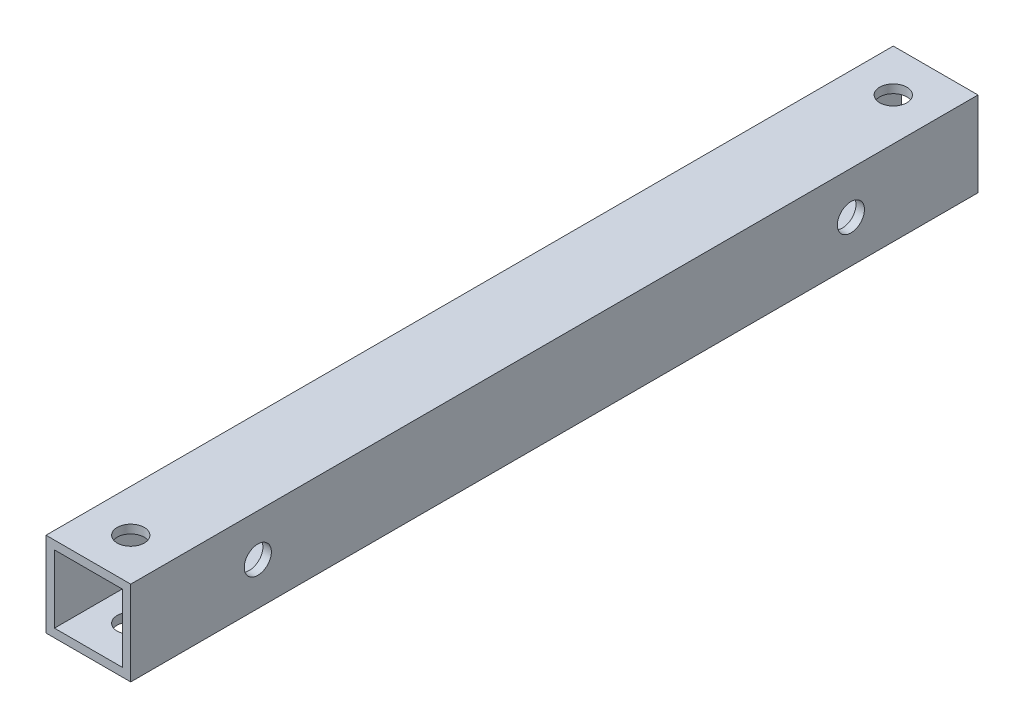
ISO-10303-21;
HEADER;
FILE_DESCRIPTION(('STEP AP214'),'2;1');
FILE_NAME('part.step','',(''),(''),'','','');
FILE_SCHEMA(('AUTOMOTIVE_DESIGN { 1 0 10303 214 1 1 1 1 }'));
ENDSEC;
DATA;
#1=APPLICATION_CONTEXT('core data for automotive mechanical design processes');
#2=APPLICATION_PROTOCOL_DEFINITION('international standard','automotive_design',2000,#1);
#3=PRODUCT_CONTEXT('',#1,'mechanical');
#4=PRODUCT('Part','Part','',(#3));
#5=PRODUCT_RELATED_PRODUCT_CATEGORY('part','',(#4));
#6=PRODUCT_DEFINITION_FORMATION('','',#4);
#7=PRODUCT_DEFINITION_CONTEXT('part definition',#1,'design');
#8=PRODUCT_DEFINITION('design','',#6,#7);
#9=PRODUCT_DEFINITION_SHAPE('','',#8);
#10=(LENGTH_UNIT() NAMED_UNIT(*) SI_UNIT(.MILLI.,.METRE.));
#11=(NAMED_UNIT(*) PLANE_ANGLE_UNIT() SI_UNIT($,.RADIAN.));
#12=(NAMED_UNIT(*) SI_UNIT($,.STERADIAN.) SOLID_ANGLE_UNIT());
#13=UNCERTAINTY_MEASURE_WITH_UNIT(LENGTH_MEASURE(1.E-05),#10,'distance_accuracy_value','');
#14=(GEOMETRIC_REPRESENTATION_CONTEXT(3) GLOBAL_UNCERTAINTY_ASSIGNED_CONTEXT((#13)) GLOBAL_UNIT_ASSIGNED_CONTEXT((#10,
#11,#12)) REPRESENTATION_CONTEXT('',''));
#15=CARTESIAN_POINT('',(0.,0.,0.));
#16=DIRECTION('',(0.,0.,1.));
#17=DIRECTION('',(1.,0.,0.));
#18=AXIS2_PLACEMENT_3D('',#15,#16,#17);
#19=CARTESIAN_POINT('',(0.,0.,100.));
#20=DIRECTION('',(0.,0.,1.));
#21=DIRECTION('',(1.,0.,0.));
#22=AXIS2_PLACEMENT_3D('',#19,#20,#21);
#23=PLANE('',#22);
#24=DIRECTION('',(0.,1.,0.));
#25=VECTOR('',#24,1.);
#26=CARTESIAN_POINT('',(5.,5.,100.));
#27=LINE('',#26,#25);
#28=CARTESIAN_POINT('',(5.,-5.,100.));
#29=VERTEX_POINT('',#28);
#30=CARTESIAN_POINT('',(5.,5.,100.));
#31=VERTEX_POINT('',#30);
#32=EDGE_CURVE('E139',#29,#31,#27,.T.);
#33=ORIENTED_EDGE('',*,*,#32,.T.);
#34=DIRECTION('',(-1.,0.,0.));
#35=VECTOR('',#34,1.);
#36=CARTESIAN_POINT('',(-5.,5.,100.));
#37=LINE('',#36,#35);
#38=CARTESIAN_POINT('',(-5.,5.,100.));
#39=VERTEX_POINT('',#38);
#40=EDGE_CURVE('E142',#31,#39,#37,.T.);
#41=ORIENTED_EDGE('',*,*,#40,.T.);
#42=DIRECTION('',(0.,-1.,0.));
#43=VECTOR('',#42,1.);
#44=CARTESIAN_POINT('',(-5.,5.,100.));
#45=LINE('',#44,#43);
#46=CARTESIAN_POINT('',(-5.,-5.,100.));
#47=VERTEX_POINT('',#46);
#48=EDGE_CURVE('E145',#39,#47,#45,.T.);
#49=ORIENTED_EDGE('',*,*,#48,.T.);
#50=DIRECTION('',(1.,0.,0.));
#51=VECTOR('',#50,1.);
#52=CARTESIAN_POINT('',(-5.,-5.,100.));
#53=LINE('',#52,#51);
#54=EDGE_CURVE('E147',#47,#29,#53,.T.);
#55=ORIENTED_EDGE('',*,*,#54,.T.);
#56=EDGE_LOOP('',(#33,#41,#49,#55));
#57=FACE_BOUND('',#56,.T.);
#58=DIRECTION('',(0.,-1.,0.));
#59=VECTOR('',#58,1.);
#60=CARTESIAN_POINT('',(-4.,4.,100.));
#61=LINE('',#60,#59);
#62=CARTESIAN_POINT('',(-4.,4.,100.));
#63=VERTEX_POINT('',#62);
#64=CARTESIAN_POINT('',(-4.,-4.,100.));
#65=VERTEX_POINT('',#64);
#66=EDGE_CURVE('E109',#63,#65,#61,.T.);
#67=ORIENTED_EDGE('',*,*,#66,.F.);
#68=DIRECTION('',(-1.,0.,0.));
#69=VECTOR('',#68,1.);
#70=CARTESIAN_POINT('',(-4.,4.,100.));
#71=LINE('',#70,#69);
#72=CARTESIAN_POINT('',(4.,4.,100.));
#73=VERTEX_POINT('',#72);
#74=EDGE_CURVE('E101',#73,#63,#71,.T.);
#75=ORIENTED_EDGE('',*,*,#74,.F.);
#76=DIRECTION('',(0.,1.,0.));
#77=VECTOR('',#76,1.);
#78=CARTESIAN_POINT('',(4.,4.,100.));
#79=LINE('',#78,#77);
#80=CARTESIAN_POINT('',(4.,-4.,100.));
#81=VERTEX_POINT('',#80);
#82=EDGE_CURVE('E123',#81,#73,#79,.T.);
#83=ORIENTED_EDGE('',*,*,#82,.F.);
#84=DIRECTION('',(1.,0.,0.));
#85=VECTOR('',#84,1.);
#86=CARTESIAN_POINT('',(-4.,-4.,100.));
#87=LINE('',#86,#85);
#88=EDGE_CURVE('E121',#65,#81,#87,.T.);
#89=ORIENTED_EDGE('',*,*,#88,.F.);
#90=EDGE_LOOP('',(#67,#75,#83,#89));
#91=FACE_BOUND('',#90,.T.);
#92=ADVANCED_FACE('F34',(#57,#91),#23,.T.);
#93=CARTESIAN_POINT('',(0.,0.,0.));
#94=DIRECTION('',(0.,0.,1.));
#95=DIRECTION('',(1.,0.,0.));
#96=AXIS2_PLACEMENT_3D('',#93,#94,#95);
#97=PLANE('',#96);
#98=DIRECTION('',(0.,1.,0.));
#99=VECTOR('',#98,1.);
#100=CARTESIAN_POINT('',(5.,5.,0.));
#101=LINE('',#100,#99);
#102=CARTESIAN_POINT('',(5.,-5.,0.));
#103=VERTEX_POINT('',#102);
#104=CARTESIAN_POINT('',(5.,5.,0.));
#105=VERTEX_POINT('',#104);
#106=EDGE_CURVE('E117',#103,#105,#101,.T.);
#107=ORIENTED_EDGE('',*,*,#106,.F.);
#108=DIRECTION('',(1.,0.,0.));
#109=VECTOR('',#108,1.);
#110=CARTESIAN_POINT('',(-5.,-5.,0.));
#111=LINE('',#110,#109);
#112=CARTESIAN_POINT('',(-5.,-5.,0.));
#113=VERTEX_POINT('',#112);
#114=EDGE_CURVE('E143',#113,#103,#111,.T.);
#115=ORIENTED_EDGE('',*,*,#114,.F.);
#116=DIRECTION('',(0.,-1.,0.));
#117=VECTOR('',#116,1.);
#118=CARTESIAN_POINT('',(-5.,5.,0.));
#119=LINE('',#118,#117);
#120=CARTESIAN_POINT('',(-5.,5.,0.));
#121=VERTEX_POINT('',#120);
#122=EDGE_CURVE('E154',#121,#113,#119,.T.);
#123=ORIENTED_EDGE('',*,*,#122,.F.);
#124=DIRECTION('',(-1.,0.,0.));
#125=VECTOR('',#124,1.);
#126=CARTESIAN_POINT('',(-5.,5.,0.));
#127=LINE('',#126,#125);
#128=EDGE_CURVE('E152',#105,#121,#127,.T.);
#129=ORIENTED_EDGE('',*,*,#128,.F.);
#130=EDGE_LOOP('',(#107,#115,#123,#129));
#131=FACE_BOUND('',#130,.T.);
#132=DIRECTION('',(-1.,0.,0.));
#133=VECTOR('',#132,1.);
#134=CARTESIAN_POINT('',(-4.,4.,0.));
#135=LINE('',#134,#133);
#136=CARTESIAN_POINT('',(4.,4.,0.));
#137=VERTEX_POINT('',#136);
#138=CARTESIAN_POINT('',(-4.,4.,0.));
#139=VERTEX_POINT('',#138);
#140=EDGE_CURVE('E59',#137,#139,#135,.T.);
#141=ORIENTED_EDGE('',*,*,#140,.T.);
#142=DIRECTION('',(0.,-1.,0.));
#143=VECTOR('',#142,1.);
#144=CARTESIAN_POINT('',(-4.,4.,0.));
#145=LINE('',#144,#143);
#146=CARTESIAN_POINT('',(-4.,-4.,0.));
#147=VERTEX_POINT('',#146);
#148=EDGE_CURVE('E116',#139,#147,#145,.T.);
#149=ORIENTED_EDGE('',*,*,#148,.T.);
#150=DIRECTION('',(1.,0.,0.));
#151=VECTOR('',#150,1.);
#152=CARTESIAN_POINT('',(-4.,-4.,0.));
#153=LINE('',#152,#151);
#154=CARTESIAN_POINT('',(4.,-4.,0.));
#155=VERTEX_POINT('',#154);
#156=EDGE_CURVE('E131',#147,#155,#153,.T.);
#157=ORIENTED_EDGE('',*,*,#156,.T.);
#158=DIRECTION('',(0.,1.,0.));
#159=VECTOR('',#158,1.);
#160=CARTESIAN_POINT('',(4.,4.,0.));
#161=LINE('',#160,#159);
#162=EDGE_CURVE('E110',#155,#137,#161,.T.);
#163=ORIENTED_EDGE('',*,*,#162,.T.);
#164=EDGE_LOOP('',(#141,#149,#157,#163));
#165=FACE_BOUND('',#164,.T.);
#166=ADVANCED_FACE('F245',(#131,#165),#97,.F.);
#167=CARTESIAN_POINT('',(5.,5.,100.));
#168=DIRECTION('',(-1.,0.,0.));
#169=DIRECTION('',(0.,-1.,0.));
#170=AXIS2_PLACEMENT_3D('',#167,#168,#169);
#171=PLANE('',#170);
#172=CARTESIAN_POINT('',(5.,0.,85.));
#173=DIRECTION('',(1.,0.,0.));
#174=DIRECTION('',(0.,1.,0.));
#175=AXIS2_PLACEMENT_3D('',#172,#173,#174);
#176=CIRCLE('',#175,1.60000000000001);
#177=CARTESIAN_POINT('',(5.,1.60000000000001,85.));
#178=VERTEX_POINT('',#177);
#179=EDGE_CURVE('E199',#178,#178,#176,.T.);
#180=ORIENTED_EDGE('',*,*,#179,.F.);
#181=EDGE_LOOP('',(#180));
#182=FACE_BOUND('',#181,.T.);
#183=CARTESIAN_POINT('',(5.,0.,15.));
#184=DIRECTION('',(1.,0.,0.));
#185=DIRECTION('',(0.,1.,0.));
#186=AXIS2_PLACEMENT_3D('',#183,#184,#185);
#187=CIRCLE('',#186,1.6);
#188=CARTESIAN_POINT('',(5.,1.6,15.));
#189=VERTEX_POINT('',#188);
#190=EDGE_CURVE('E196',#189,#189,#187,.T.);
#191=ORIENTED_EDGE('',*,*,#190,.F.);
#192=EDGE_LOOP('',(#191));
#193=FACE_BOUND('',#192,.T.);
#194=ORIENTED_EDGE('',*,*,#106,.T.);
#195=DIRECTION('',(0.,0.,-1.));
#196=VECTOR('',#195,1.);
#197=CARTESIAN_POINT('',(5.,5.,100.));
#198=LINE('',#197,#196);
#199=EDGE_CURVE('E11',#31,#105,#198,.T.);
#200=ORIENTED_EDGE('',*,*,#199,.F.);
#201=ORIENTED_EDGE('',*,*,#32,.F.);
#202=DIRECTION('',(0.,0.,-1.));
#203=VECTOR('',#202,1.);
#204=CARTESIAN_POINT('',(5.,-5.,100.));
#205=LINE('',#204,#203);
#206=EDGE_CURVE('E149',#29,#103,#205,.T.);
#207=ORIENTED_EDGE('',*,*,#206,.T.);
#208=EDGE_LOOP('',(#194,#200,#201,#207));
#209=FACE_BOUND('',#208,.T.);
#210=ADVANCED_FACE('F36',(#182,#193,#209),#171,.F.);
#211=CARTESIAN_POINT('',(-5.,5.,100.));
#212=DIRECTION('',(0.,-1.,0.));
#213=DIRECTION('',(0.,0.,-1.));
#214=AXIS2_PLACEMENT_3D('',#211,#212,#213);
#215=PLANE('',#214);
#216=CARTESIAN_POINT('',(0.,5.,95.));
#217=DIRECTION('',(0.,1.,0.));
#218=DIRECTION('',(0.,0.,1.));
#219=AXIS2_PLACEMENT_3D('',#216,#217,#218);
#220=CIRCLE('',#219,1.6);
#221=CARTESIAN_POINT('',(0.,5.,96.6));
#222=VERTEX_POINT('',#221);
#223=EDGE_CURVE('E174',#222,#222,#220,.T.);
#224=ORIENTED_EDGE('',*,*,#223,.F.);
#225=EDGE_LOOP('',(#224));
#226=FACE_BOUND('',#225,.T.);
#227=CARTESIAN_POINT('',(0.,5.,5.));
#228=DIRECTION('',(0.,1.,0.));
#229=DIRECTION('',(0.,0.,1.));
#230=AXIS2_PLACEMENT_3D('',#227,#228,#229);
#231=CIRCLE('',#230,1.6);
#232=CARTESIAN_POINT('',(0.,5.,6.60000000000001));
#233=VERTEX_POINT('',#232);
#234=EDGE_CURVE('E181',#233,#233,#231,.T.);
#235=ORIENTED_EDGE('',*,*,#234,.F.);
#236=EDGE_LOOP('',(#235));
#237=FACE_BOUND('',#236,.T.);
#238=ORIENTED_EDGE('',*,*,#128,.T.);
#239=DIRECTION('',(0.,0.,-1.));
#240=VECTOR('',#239,1.);
#241=CARTESIAN_POINT('',(-5.,5.,100.));
#242=LINE('',#241,#240);
#243=EDGE_CURVE('E43',#39,#121,#242,.T.);
#244=ORIENTED_EDGE('',*,*,#243,.F.);
#245=ORIENTED_EDGE('',*,*,#40,.F.);
#246=ORIENTED_EDGE('',*,*,#199,.T.);
#247=EDGE_LOOP('',(#238,#244,#245,#246));
#248=FACE_BOUND('',#247,.T.);
#249=ADVANCED_FACE('F232',(#226,#237,#248),#215,.F.);
#250=CARTESIAN_POINT('',(-5.,5.,100.));
#251=DIRECTION('',(1.,0.,0.));
#252=DIRECTION('',(0.,1.,0.));
#253=AXIS2_PLACEMENT_3D('',#250,#251,#252);
#254=PLANE('',#253);
#255=CARTESIAN_POINT('',(-5.,0.,85.));
#256=DIRECTION('',(1.,0.,0.));
#257=DIRECTION('',(0.,1.,0.));
#258=AXIS2_PLACEMENT_3D('',#255,#256,#257);
#259=CIRCLE('',#258,1.60000000000001);
#260=CARTESIAN_POINT('',(-5.,1.6,85.));
#261=VERTEX_POINT('',#260);
#262=EDGE_CURVE('E168',#261,#261,#259,.T.);
#263=ORIENTED_EDGE('',*,*,#262,.T.);
#264=EDGE_LOOP('',(#263));
#265=FACE_BOUND('',#264,.T.);
#266=CARTESIAN_POINT('',(-5.,0.,15.));
#267=DIRECTION('',(1.,0.,0.));
#268=DIRECTION('',(0.,1.,0.));
#269=AXIS2_PLACEMENT_3D('',#266,#267,#268);
#270=CIRCLE('',#269,1.6);
#271=CARTESIAN_POINT('',(-5.,1.6,15.));
#272=VERTEX_POINT('',#271);
#273=EDGE_CURVE('E202',#272,#272,#270,.T.);
#274=ORIENTED_EDGE('',*,*,#273,.T.);
#275=EDGE_LOOP('',(#274));
#276=FACE_BOUND('',#275,.T.);
#277=ORIENTED_EDGE('',*,*,#122,.T.);
#278=DIRECTION('',(0.,0.,-1.));
#279=VECTOR('',#278,1.);
#280=CARTESIAN_POINT('',(-5.,-5.,100.));
#281=LINE('',#280,#279);
#282=EDGE_CURVE('E159',#47,#113,#281,.T.);
#283=ORIENTED_EDGE('',*,*,#282,.F.);
#284=ORIENTED_EDGE('',*,*,#48,.F.);
#285=ORIENTED_EDGE('',*,*,#243,.T.);
#286=EDGE_LOOP('',(#277,#283,#284,#285));
#287=FACE_BOUND('',#286,.T.);
#288=ADVANCED_FACE('F228',(#265,#276,#287),#254,.F.);
#289=CARTESIAN_POINT('',(-5.,-5.,100.));
#290=DIRECTION('',(0.,1.,0.));
#291=DIRECTION('',(0.,0.,1.));
#292=AXIS2_PLACEMENT_3D('',#289,#290,#291);
#293=PLANE('',#292);
#294=CARTESIAN_POINT('',(0.,-5.,95.));
#295=DIRECTION('',(0.,1.,0.));
#296=DIRECTION('',(0.,0.,1.));
#297=AXIS2_PLACEMENT_3D('',#294,#295,#296);
#298=CIRCLE('',#297,1.6);
#299=CARTESIAN_POINT('',(0.,-5.,96.6));
#300=VERTEX_POINT('',#299);
#301=EDGE_CURVE('E193',#300,#300,#298,.T.);
#302=ORIENTED_EDGE('',*,*,#301,.T.);
#303=EDGE_LOOP('',(#302));
#304=FACE_BOUND('',#303,.T.);
#305=CARTESIAN_POINT('',(0.,-5.,5.));
#306=DIRECTION('',(0.,1.,0.));
#307=DIRECTION('',(0.,0.,1.));
#308=AXIS2_PLACEMENT_3D('',#305,#306,#307);
#309=CIRCLE('',#308,1.6);
#310=CARTESIAN_POINT('',(0.,-5.,6.60000000000001));
#311=VERTEX_POINT('',#310);
#312=EDGE_CURVE('E178',#311,#311,#309,.T.);
#313=ORIENTED_EDGE('',*,*,#312,.T.);
#314=EDGE_LOOP('',(#313));
#315=FACE_BOUND('',#314,.T.);
#316=ORIENTED_EDGE('',*,*,#114,.T.);
#317=ORIENTED_EDGE('',*,*,#206,.F.);
#318=ORIENTED_EDGE('',*,*,#54,.F.);
#319=ORIENTED_EDGE('',*,*,#282,.T.);
#320=EDGE_LOOP('',(#316,#317,#318,#319));
#321=FACE_BOUND('',#320,.T.);
#322=ADVANCED_FACE('F231',(#304,#315,#321),#293,.F.);
#323=CARTESIAN_POINT('',(-4.,4.,100.));
#324=DIRECTION('',(0.,-1.,0.));
#325=DIRECTION('',(0.,0.,-1.));
#326=AXIS2_PLACEMENT_3D('',#323,#324,#325);
#327=PLANE('',#326);
#328=CARTESIAN_POINT('',(0.,4.,95.));
#329=DIRECTION('',(0.,-1.,0.));
#330=DIRECTION('',(0.,0.,-1.));
#331=AXIS2_PLACEMENT_3D('',#328,#329,#330);
#332=CIRCLE('',#331,1.6);
#333=CARTESIAN_POINT('',(0.,4.,93.4));
#334=VERTEX_POINT('',#333);
#335=EDGE_CURVE('E190',#334,#334,#332,.T.);
#336=ORIENTED_EDGE('',*,*,#335,.F.);
#337=EDGE_LOOP('',(#336));
#338=FACE_BOUND('',#337,.T.);
#339=CARTESIAN_POINT('',(0.,4.,5.));
#340=DIRECTION('',(0.,-1.,0.));
#341=DIRECTION('',(0.,0.,-1.));
#342=AXIS2_PLACEMENT_3D('',#339,#340,#341);
#343=CIRCLE('',#342,1.6);
#344=CARTESIAN_POINT('',(0.,4.,3.4));
#345=VERTEX_POINT('',#344);
#346=EDGE_CURVE('E173',#345,#345,#343,.T.);
#347=ORIENTED_EDGE('',*,*,#346,.F.);
#348=EDGE_LOOP('',(#347));
#349=FACE_BOUND('',#348,.T.);
#350=ORIENTED_EDGE('',*,*,#140,.F.);
#351=DIRECTION('',(0.,0.,-1.));
#352=VECTOR('',#351,1.);
#353=CARTESIAN_POINT('',(4.,4.,100.));
#354=LINE('',#353,#352);
#355=EDGE_CURVE('E105',#73,#137,#354,.T.);
#356=ORIENTED_EDGE('',*,*,#355,.F.);
#357=ORIENTED_EDGE('',*,*,#74,.T.);
#358=DIRECTION('',(0.,0.,-1.));
#359=VECTOR('',#358,1.);
#360=CARTESIAN_POINT('',(-4.,4.,100.));
#361=LINE('',#360,#359);
#362=EDGE_CURVE('E104',#63,#139,#361,.T.);
#363=ORIENTED_EDGE('',*,*,#362,.T.);
#364=EDGE_LOOP('',(#350,#356,#357,#363));
#365=FACE_BOUND('',#364,.T.);
#366=ADVANCED_FACE('F103',(#338,#349,#365),#327,.T.);
#367=CARTESIAN_POINT('',(-4.,4.,100.));
#368=DIRECTION('',(1.,0.,0.));
#369=DIRECTION('',(0.,1.,0.));
#370=AXIS2_PLACEMENT_3D('',#367,#368,#369);
#371=PLANE('',#370);
#372=CARTESIAN_POINT('',(-4.,0.,85.));
#373=DIRECTION('',(1.,0.,0.));
#374=DIRECTION('',(0.,1.,0.));
#375=AXIS2_PLACEMENT_3D('',#372,#373,#374);
#376=CIRCLE('',#375,1.60000000000001);
#377=CARTESIAN_POINT('',(-4.,1.6,85.));
#378=VERTEX_POINT('',#377);
#379=EDGE_CURVE('E129',#378,#378,#376,.T.);
#380=ORIENTED_EDGE('',*,*,#379,.F.);
#381=EDGE_LOOP('',(#380));
#382=FACE_BOUND('',#381,.T.);
#383=CARTESIAN_POINT('',(-4.,0.,15.));
#384=DIRECTION('',(1.,0.,0.));
#385=DIRECTION('',(0.,1.,0.));
#386=AXIS2_PLACEMENT_3D('',#383,#384,#385);
#387=CIRCLE('',#386,1.6);
#388=CARTESIAN_POINT('',(-4.,1.6,15.));
#389=VERTEX_POINT('',#388);
#390=EDGE_CURVE('E167',#389,#389,#387,.T.);
#391=ORIENTED_EDGE('',*,*,#390,.F.);
#392=EDGE_LOOP('',(#391));
#393=FACE_BOUND('',#392,.T.);
#394=ORIENTED_EDGE('',*,*,#148,.F.);
#395=ORIENTED_EDGE('',*,*,#362,.F.);
#396=ORIENTED_EDGE('',*,*,#66,.T.);
#397=DIRECTION('',(0.,0.,-1.));
#398=VECTOR('',#397,1.);
#399=CARTESIAN_POINT('',(-4.,-4.,100.));
#400=LINE('',#399,#398);
#401=EDGE_CURVE('E118',#65,#147,#400,.T.);
#402=ORIENTED_EDGE('',*,*,#401,.T.);
#403=EDGE_LOOP('',(#394,#395,#396,#402));
#404=FACE_BOUND('',#403,.T.);
#405=ADVANCED_FACE('F113',(#382,#393,#404),#371,.T.);
#406=CARTESIAN_POINT('',(-4.,-4.,100.));
#407=DIRECTION('',(0.,1.,0.));
#408=DIRECTION('',(-1.,0.,0.));
#409=AXIS2_PLACEMENT_3D('',#406,#407,#408);
#410=PLANE('',#409);
#411=CARTESIAN_POINT('',(0.,-4.,95.));
#412=DIRECTION('',(0.,1.,0.));
#413=DIRECTION('',(-1.,0.,0.));
#414=AXIS2_PLACEMENT_3D('',#411,#412,#413);
#415=CIRCLE('',#414,1.6);
#416=CARTESIAN_POINT('',(-1.6,-4.,95.));
#417=VERTEX_POINT('',#416);
#418=EDGE_CURVE('E38',#417,#417,#415,.T.);
#419=ORIENTED_EDGE('',*,*,#418,.F.);
#420=EDGE_LOOP('',(#419));
#421=FACE_BOUND('',#420,.T.);
#422=CARTESIAN_POINT('',(0.,-4.,5.));
#423=DIRECTION('',(0.,1.,0.));
#424=DIRECTION('',(-1.,0.,0.));
#425=AXIS2_PLACEMENT_3D('',#422,#423,#424);
#426=CIRCLE('',#425,1.6);
#427=CARTESIAN_POINT('',(-1.6,-4.,5.));
#428=VERTEX_POINT('',#427);
#429=EDGE_CURVE('E171',#428,#428,#426,.T.);
#430=ORIENTED_EDGE('',*,*,#429,.F.);
#431=EDGE_LOOP('',(#430));
#432=FACE_BOUND('',#431,.T.);
#433=ORIENTED_EDGE('',*,*,#156,.F.);
#434=ORIENTED_EDGE('',*,*,#401,.F.);
#435=ORIENTED_EDGE('',*,*,#88,.T.);
#436=DIRECTION('',(0.,0.,-1.));
#437=VECTOR('',#436,1.);
#438=CARTESIAN_POINT('',(4.,-4.,100.));
#439=LINE('',#438,#437);
#440=EDGE_CURVE('E51',#81,#155,#439,.T.);
#441=ORIENTED_EDGE('',*,*,#440,.T.);
#442=EDGE_LOOP('',(#433,#434,#435,#441));
#443=FACE_BOUND('',#442,.T.);
#444=ADVANCED_FACE('F216',(#421,#432,#443),#410,.T.);
#445=CARTESIAN_POINT('',(4.,4.,100.));
#446=DIRECTION('',(-1.,0.,0.));
#447=DIRECTION('',(0.,-1.,0.));
#448=AXIS2_PLACEMENT_3D('',#445,#446,#447);
#449=PLANE('',#448);
#450=CARTESIAN_POINT('',(4.,0.,85.));
#451=DIRECTION('',(-1.,0.,0.));
#452=DIRECTION('',(0.,-1.,0.));
#453=AXIS2_PLACEMENT_3D('',#450,#451,#452);
#454=CIRCLE('',#453,1.60000000000001);
#455=CARTESIAN_POINT('',(4.,1.60000000000001,85.));
#456=VERTEX_POINT('',#455);
#457=EDGE_CURVE('E169',#456,#456,#454,.T.);
#458=ORIENTED_EDGE('',*,*,#457,.F.);
#459=EDGE_LOOP('',(#458));
#460=FACE_BOUND('',#459,.T.);
#461=CARTESIAN_POINT('',(4.,0.,15.));
#462=DIRECTION('',(-1.,0.,0.));
#463=DIRECTION('',(0.,-1.,0.));
#464=AXIS2_PLACEMENT_3D('',#461,#462,#463);
#465=CIRCLE('',#464,1.6);
#466=CARTESIAN_POINT('',(4.,1.6,15.));
#467=VERTEX_POINT('',#466);
#468=EDGE_CURVE('E164',#467,#467,#465,.T.);
#469=ORIENTED_EDGE('',*,*,#468,.F.);
#470=EDGE_LOOP('',(#469));
#471=FACE_BOUND('',#470,.T.);
#472=ORIENTED_EDGE('',*,*,#162,.F.);
#473=ORIENTED_EDGE('',*,*,#440,.F.);
#474=ORIENTED_EDGE('',*,*,#82,.T.);
#475=ORIENTED_EDGE('',*,*,#355,.T.);
#476=EDGE_LOOP('',(#472,#473,#474,#475));
#477=FACE_BOUND('',#476,.T.);
#478=ADVANCED_FACE('F327',(#460,#471,#477),#449,.T.);
#479=CARTESIAN_POINT('',(-5.,0.,15.));
#480=DIRECTION('',(1.,0.,0.));
#481=DIRECTION('',(0.,1.,0.));
#482=AXIS2_PLACEMENT_3D('',#479,#480,#481);
#483=CYLINDRICAL_SURFACE('',#482,1.6);
#484=CARTESIAN_POINT('',(4.,1.6,15.));
#485=CARTESIAN_POINT('',(4.01041666666667,1.6,15.));
#486=CARTESIAN_POINT('',(4.02083333333333,1.6,15.));
#487=CARTESIAN_POINT('',(4.04166666666667,1.6,15.));
#488=CARTESIAN_POINT('',(4.05208333333333,1.6,15.));
#489=CARTESIAN_POINT('',(4.07291666666667,1.6,15.));
#490=CARTESIAN_POINT('',(4.08333333333333,1.6,15.));
#491=CARTESIAN_POINT('',(4.10416666666667,1.6,15.));
#492=CARTESIAN_POINT('',(4.11458333333333,1.6,15.));
#493=CARTESIAN_POINT('',(4.13541666666667,1.6,15.));
#494=CARTESIAN_POINT('',(4.14583333333333,1.6,15.));
#495=CARTESIAN_POINT('',(4.16666666666667,1.6,15.));
#496=CARTESIAN_POINT('',(4.17708333333333,1.6,15.));
#497=CARTESIAN_POINT('',(4.19791666666667,1.6,15.));
#498=CARTESIAN_POINT('',(4.20833333333333,1.6,15.));
#499=CARTESIAN_POINT('',(4.22916666666667,1.6,15.));
#500=CARTESIAN_POINT('',(4.23958333333333,1.6,15.));
#501=CARTESIAN_POINT('',(4.26041666666667,1.6,15.));
#502=CARTESIAN_POINT('',(4.27083333333333,1.6,15.));
#503=CARTESIAN_POINT('',(4.29166666666667,1.6,15.));
#504=CARTESIAN_POINT('',(4.30208333333333,1.6,15.));
#505=CARTESIAN_POINT('',(4.32291666666667,1.6,15.));
#506=CARTESIAN_POINT('',(4.33333333333333,1.6,15.));
#507=CARTESIAN_POINT('',(4.35416666666667,1.6,15.));
#508=CARTESIAN_POINT('',(4.36458333333333,1.6,15.));
#509=CARTESIAN_POINT('',(4.38541666666667,1.6,15.));
#510=CARTESIAN_POINT('',(4.39583333333333,1.6,15.));
#511=CARTESIAN_POINT('',(4.41666666666667,1.6,15.));
#512=CARTESIAN_POINT('',(4.42708333333333,1.6,15.));
#513=CARTESIAN_POINT('',(4.44791666666667,1.6,15.));
#514=CARTESIAN_POINT('',(4.45833333333333,1.6,15.));
#515=CARTESIAN_POINT('',(4.47916666666667,1.6,15.));
#516=CARTESIAN_POINT('',(4.48958333333333,1.6,15.));
#517=CARTESIAN_POINT('',(4.51041666666667,1.6,15.));
#518=CARTESIAN_POINT('',(4.52083333333333,1.6,15.));
#519=CARTESIAN_POINT('',(4.54166666666667,1.6,15.));
#520=CARTESIAN_POINT('',(4.55208333333333,1.6,15.));
#521=CARTESIAN_POINT('',(4.57291666666667,1.6,15.));
#522=CARTESIAN_POINT('',(4.58333333333333,1.6,15.));
#523=CARTESIAN_POINT('',(4.60416666666667,1.6,15.));
#524=CARTESIAN_POINT('',(4.61458333333333,1.6,15.));
#525=CARTESIAN_POINT('',(4.63541666666667,1.6,15.));
#526=CARTESIAN_POINT('',(4.64583333333333,1.6,15.));
#527=CARTESIAN_POINT('',(4.66666666666667,1.6,15.));
#528=CARTESIAN_POINT('',(4.67708333333333,1.6,15.));
#529=CARTESIAN_POINT('',(4.69791666666667,1.6,15.));
#530=CARTESIAN_POINT('',(4.70833333333333,1.6,15.));
#531=CARTESIAN_POINT('',(4.72916666666667,1.6,15.));
#532=CARTESIAN_POINT('',(4.73958333333333,1.6,15.));
#533=CARTESIAN_POINT('',(4.76041666666667,1.6,15.));
#534=CARTESIAN_POINT('',(4.77083333333333,1.6,15.));
#535=CARTESIAN_POINT('',(4.79166666666667,1.6,15.));
#536=CARTESIAN_POINT('',(4.80208333333333,1.6,15.));
#537=CARTESIAN_POINT('',(4.82291666666667,1.6,15.));
#538=CARTESIAN_POINT('',(4.83333333333333,1.6,15.));
#539=CARTESIAN_POINT('',(4.85416666666667,1.6,15.));
#540=CARTESIAN_POINT('',(4.86458333333333,1.6,15.));
#541=CARTESIAN_POINT('',(4.88541666666667,1.6,15.));
#542=CARTESIAN_POINT('',(4.89583333333333,1.6,15.));
#543=CARTESIAN_POINT('',(4.91666666666667,1.6,15.));
#544=CARTESIAN_POINT('',(4.92708333333333,1.6,15.));
#545=CARTESIAN_POINT('',(4.94791666666667,1.6,15.));
#546=CARTESIAN_POINT('',(4.95833333333333,1.6,15.));
#547=CARTESIAN_POINT('',(4.97916666666667,1.6,15.));
#548=CARTESIAN_POINT('',(4.98958333333333,1.6,15.));
#549=CARTESIAN_POINT('',(5.,1.6,15.));
#550=B_SPLINE_CURVE_WITH_KNOTS('',3,(#484,#485,#486,#487,#488,#489,#490,#491,#492,#493,#494,
#495,#496,#497,#498,#499,#500,#501,#502,#503,#504,#505,#506,#507,#508,#509,#510,#511,#512,#513,
#514,#515,#516,#517,#518,#519,#520,#521,#522,#523,#524,#525,#526,#527,#528,#529,#530,#531,#532,
#533,#534,#535,#536,#537,#538,#539,#540,#541,#542,#543,#544,#545,#546,#547,#548,#549),
.UNSPECIFIED.,.F.,.F.,(4,2,2,2,2,2,2,2,2,2,2,2,2,2,2,2,2,2,2,2,2,2,2,2,2,2,2,2,2,2,2,2,4),(0.,
0.03125,0.0625000000000001,0.0937500000000001,0.125,0.15625,0.1875,0.21875,0.25,0.28125,0.3125,
0.34375,0.375,0.40625,0.4375,0.46875,0.5,0.53125,0.5625,0.593750000000001,0.625000000000001,
0.656250000000001,0.687500000000001,0.718750000000001,0.750000000000001,0.781250000000001,
0.812500000000001,0.843750000000001,0.875000000000001,0.906250000000001,0.937500000000001,
0.968750000000001,1.),.UNSPECIFIED.);
#551=EDGE_CURVE('BSEAM225',#467,#189,#550,.T.);
#552=ORIENTED_EDGE('',*,*,#468,.T.);
#553=ORIENTED_EDGE('',*,*,#190,.T.);
#554=ORIENTED_EDGE('',*,*,#551,.T.);
#555=ORIENTED_EDGE('',*,*,#551,.F.);
#556=EDGE_LOOP('',(#552,#554,#553,#555));
#557=FACE_BOUND('',#556,.T.);
#558=ADVANCED_FACE('F225',(#557),#483,.F.);
#559=CARTESIAN_POINT('',(-5.,0.,85.));
#560=DIRECTION('',(1.,0.,0.));
#561=DIRECTION('',(0.,1.,0.));
#562=AXIS2_PLACEMENT_3D('',#559,#560,#561);
#563=CYLINDRICAL_SURFACE('',#562,1.60000000000001);
#564=CARTESIAN_POINT('',(4.,1.60000000000001,85.));
#565=CARTESIAN_POINT('',(4.01041666666667,1.60000000000001,85.));
#566=CARTESIAN_POINT('',(4.02083333333333,1.60000000000001,85.));
#567=CARTESIAN_POINT('',(4.04166666666667,1.60000000000001,85.));
#568=CARTESIAN_POINT('',(4.05208333333333,1.60000000000001,85.));
#569=CARTESIAN_POINT('',(4.07291666666667,1.60000000000001,85.));
#570=CARTESIAN_POINT('',(4.08333333333333,1.60000000000001,85.));
#571=CARTESIAN_POINT('',(4.10416666666667,1.60000000000001,85.));
#572=CARTESIAN_POINT('',(4.11458333333333,1.60000000000001,85.));
#573=CARTESIAN_POINT('',(4.13541666666667,1.60000000000001,85.));
#574=CARTESIAN_POINT('',(4.14583333333333,1.60000000000001,85.));
#575=CARTESIAN_POINT('',(4.16666666666667,1.60000000000001,85.));
#576=CARTESIAN_POINT('',(4.17708333333333,1.60000000000001,85.));
#577=CARTESIAN_POINT('',(4.19791666666667,1.60000000000001,85.));
#578=CARTESIAN_POINT('',(4.20833333333333,1.60000000000001,85.));
#579=CARTESIAN_POINT('',(4.22916666666667,1.60000000000001,85.));
#580=CARTESIAN_POINT('',(4.23958333333333,1.60000000000001,85.));
#581=CARTESIAN_POINT('',(4.26041666666667,1.60000000000001,85.));
#582=CARTESIAN_POINT('',(4.27083333333333,1.60000000000001,85.));
#583=CARTESIAN_POINT('',(4.29166666666667,1.60000000000001,85.));
#584=CARTESIAN_POINT('',(4.30208333333333,1.60000000000001,85.));
#585=CARTESIAN_POINT('',(4.32291666666667,1.60000000000001,85.));
#586=CARTESIAN_POINT('',(4.33333333333333,1.60000000000001,85.));
#587=CARTESIAN_POINT('',(4.35416666666667,1.60000000000001,85.));
#588=CARTESIAN_POINT('',(4.36458333333333,1.60000000000001,85.));
#589=CARTESIAN_POINT('',(4.38541666666667,1.60000000000001,85.));
#590=CARTESIAN_POINT('',(4.39583333333333,1.60000000000001,85.));
#591=CARTESIAN_POINT('',(4.41666666666667,1.60000000000001,85.));
#592=CARTESIAN_POINT('',(4.42708333333333,1.60000000000001,85.));
#593=CARTESIAN_POINT('',(4.44791666666667,1.60000000000001,85.));
#594=CARTESIAN_POINT('',(4.45833333333333,1.60000000000001,85.));
#595=CARTESIAN_POINT('',(4.47916666666667,1.60000000000001,85.));
#596=CARTESIAN_POINT('',(4.48958333333333,1.60000000000001,85.));
#597=CARTESIAN_POINT('',(4.51041666666667,1.60000000000001,85.));
#598=CARTESIAN_POINT('',(4.52083333333333,1.60000000000001,85.));
#599=CARTESIAN_POINT('',(4.54166666666667,1.60000000000001,85.));
#600=CARTESIAN_POINT('',(4.55208333333333,1.60000000000001,85.));
#601=CARTESIAN_POINT('',(4.57291666666667,1.60000000000001,85.));
#602=CARTESIAN_POINT('',(4.58333333333333,1.60000000000001,85.));
#603=CARTESIAN_POINT('',(4.60416666666667,1.60000000000001,85.));
#604=CARTESIAN_POINT('',(4.61458333333333,1.60000000000001,85.));
#605=CARTESIAN_POINT('',(4.63541666666667,1.60000000000001,85.));
#606=CARTESIAN_POINT('',(4.64583333333333,1.60000000000001,85.));
#607=CARTESIAN_POINT('',(4.66666666666667,1.60000000000001,85.));
#608=CARTESIAN_POINT('',(4.67708333333333,1.60000000000001,85.));
#609=CARTESIAN_POINT('',(4.69791666666667,1.60000000000001,85.));
#610=CARTESIAN_POINT('',(4.70833333333333,1.60000000000001,85.));
#611=CARTESIAN_POINT('',(4.72916666666667,1.60000000000001,85.));
#612=CARTESIAN_POINT('',(4.73958333333333,1.60000000000001,85.));
#613=CARTESIAN_POINT('',(4.76041666666667,1.60000000000001,85.));
#614=CARTESIAN_POINT('',(4.77083333333333,1.60000000000001,85.));
#615=CARTESIAN_POINT('',(4.79166666666667,1.60000000000001,85.));
#616=CARTESIAN_POINT('',(4.80208333333333,1.60000000000001,85.));
#617=CARTESIAN_POINT('',(4.82291666666667,1.60000000000001,85.));
#618=CARTESIAN_POINT('',(4.83333333333333,1.60000000000001,85.));
#619=CARTESIAN_POINT('',(4.85416666666667,1.60000000000001,85.));
#620=CARTESIAN_POINT('',(4.86458333333333,1.60000000000001,85.));
#621=CARTESIAN_POINT('',(4.88541666666667,1.60000000000001,85.));
#622=CARTESIAN_POINT('',(4.89583333333333,1.60000000000001,85.));
#623=CARTESIAN_POINT('',(4.91666666666667,1.60000000000001,85.));
#624=CARTESIAN_POINT('',(4.92708333333333,1.60000000000001,85.));
#625=CARTESIAN_POINT('',(4.94791666666667,1.60000000000001,85.));
#626=CARTESIAN_POINT('',(4.95833333333333,1.60000000000001,85.));
#627=CARTESIAN_POINT('',(4.97916666666667,1.60000000000001,85.));
#628=CARTESIAN_POINT('',(4.98958333333333,1.60000000000001,85.));
#629=CARTESIAN_POINT('',(5.,1.60000000000001,85.));
#630=B_SPLINE_CURVE_WITH_KNOTS('',3,(#564,#565,#566,#567,#568,#569,#570,#571,#572,#573,#574,
#575,#576,#577,#578,#579,#580,#581,#582,#583,#584,#585,#586,#587,#588,#589,#590,#591,#592,#593,
#594,#595,#596,#597,#598,#599,#600,#601,#602,#603,#604,#605,#606,#607,#608,#609,#610,#611,#612,
#613,#614,#615,#616,#617,#618,#619,#620,#621,#622,#623,#624,#625,#626,#627,#628,#629),
.UNSPECIFIED.,.F.,.F.,(4,2,2,2,2,2,2,2,2,2,2,2,2,2,2,2,2,2,2,2,2,2,2,2,2,2,2,2,2,2,2,2,4),(0.,
0.03125,0.0625000000000001,0.0937500000000001,0.125,0.15625,0.1875,0.21875,0.25,0.28125,0.3125,
0.34375,0.375,0.40625,0.4375,0.46875,0.5,0.53125,0.5625,0.593750000000001,0.625000000000001,
0.656250000000001,0.687500000000001,0.718750000000001,0.750000000000001,0.781250000000001,
0.812500000000001,0.843750000000001,0.875000000000001,0.906250000000001,0.937500000000001,
0.968750000000001,1.),.UNSPECIFIED.);
#631=EDGE_CURVE('BSEAM223',#456,#178,#630,.T.);
#632=ORIENTED_EDGE('',*,*,#457,.T.);
#633=ORIENTED_EDGE('',*,*,#179,.T.);
#634=ORIENTED_EDGE('',*,*,#631,.T.);
#635=ORIENTED_EDGE('',*,*,#631,.F.);
#636=EDGE_LOOP('',(#632,#634,#633,#635));
#637=FACE_BOUND('',#636,.T.);
#638=ADVANCED_FACE('F223',(#637),#563,.F.);
#639=CARTESIAN_POINT('',(-4.,1.6,15.));
#640=CARTESIAN_POINT('',(-4.01041666666667,1.6,15.));
#641=CARTESIAN_POINT('',(-4.02083333333333,1.6,15.));
#642=CARTESIAN_POINT('',(-4.04166666666667,1.6,15.));
#643=CARTESIAN_POINT('',(-4.05208333333333,1.6,15.));
#644=CARTESIAN_POINT('',(-4.07291666666667,1.6,15.));
#645=CARTESIAN_POINT('',(-4.08333333333333,1.6,15.));
#646=CARTESIAN_POINT('',(-4.10416666666667,1.6,15.));
#647=CARTESIAN_POINT('',(-4.11458333333333,1.6,15.));
#648=CARTESIAN_POINT('',(-4.13541666666667,1.6,15.));
#649=CARTESIAN_POINT('',(-4.14583333333333,1.6,15.));
#650=CARTESIAN_POINT('',(-4.16666666666667,1.6,15.));
#651=CARTESIAN_POINT('',(-4.17708333333333,1.6,15.));
#652=CARTESIAN_POINT('',(-4.19791666666667,1.6,15.));
#653=CARTESIAN_POINT('',(-4.20833333333333,1.6,15.));
#654=CARTESIAN_POINT('',(-4.22916666666667,1.6,15.));
#655=CARTESIAN_POINT('',(-4.23958333333333,1.6,15.));
#656=CARTESIAN_POINT('',(-4.26041666666667,1.6,15.));
#657=CARTESIAN_POINT('',(-4.27083333333333,1.6,15.));
#658=CARTESIAN_POINT('',(-4.29166666666667,1.6,15.));
#659=CARTESIAN_POINT('',(-4.30208333333334,1.6,15.));
#660=CARTESIAN_POINT('',(-4.32291666666667,1.6,15.));
#661=CARTESIAN_POINT('',(-4.33333333333334,1.6,15.));
#662=CARTESIAN_POINT('',(-4.35416666666667,1.6,15.));
#663=CARTESIAN_POINT('',(-4.36458333333334,1.6,15.));
#664=CARTESIAN_POINT('',(-4.38541666666667,1.6,15.));
#665=CARTESIAN_POINT('',(-4.39583333333334,1.6,15.));
#666=CARTESIAN_POINT('',(-4.41666666666667,1.6,15.));
#667=CARTESIAN_POINT('',(-4.42708333333334,1.6,15.));
#668=CARTESIAN_POINT('',(-4.44791666666667,1.6,15.));
#669=CARTESIAN_POINT('',(-4.45833333333334,1.6,15.));
#670=CARTESIAN_POINT('',(-4.47916666666667,1.6,15.));
#671=CARTESIAN_POINT('',(-4.48958333333334,1.6,15.));
#672=CARTESIAN_POINT('',(-4.51041666666667,1.6,15.));
#673=CARTESIAN_POINT('',(-4.52083333333334,1.6,15.));
#674=CARTESIAN_POINT('',(-4.54166666666667,1.6,15.));
#675=CARTESIAN_POINT('',(-4.55208333333334,1.6,15.));
#676=CARTESIAN_POINT('',(-4.57291666666667,1.6,15.));
#677=CARTESIAN_POINT('',(-4.58333333333334,1.6,15.));
#678=CARTESIAN_POINT('',(-4.60416666666667,1.6,15.));
#679=CARTESIAN_POINT('',(-4.61458333333334,1.6,15.));
#680=CARTESIAN_POINT('',(-4.63541666666667,1.6,15.));
#681=CARTESIAN_POINT('',(-4.64583333333334,1.6,15.));
#682=CARTESIAN_POINT('',(-4.66666666666667,1.6,15.));
#683=CARTESIAN_POINT('',(-4.67708333333334,1.6,15.));
#684=CARTESIAN_POINT('',(-4.69791666666667,1.6,15.));
#685=CARTESIAN_POINT('',(-4.70833333333334,1.6,15.));
#686=CARTESIAN_POINT('',(-4.72916666666667,1.6,15.));
#687=CARTESIAN_POINT('',(-4.73958333333334,1.6,15.));
#688=CARTESIAN_POINT('',(-4.76041666666667,1.6,15.));
#689=CARTESIAN_POINT('',(-4.77083333333334,1.6,15.));
#690=CARTESIAN_POINT('',(-4.79166666666667,1.6,15.));
#691=CARTESIAN_POINT('',(-4.80208333333334,1.6,15.));
#692=CARTESIAN_POINT('',(-4.82291666666667,1.6,15.));
#693=CARTESIAN_POINT('',(-4.83333333333334,1.6,15.));
#694=CARTESIAN_POINT('',(-4.85416666666667,1.6,15.));
#695=CARTESIAN_POINT('',(-4.86458333333334,1.6,15.));
#696=CARTESIAN_POINT('',(-4.88541666666667,1.6,15.));
#697=CARTESIAN_POINT('',(-4.89583333333334,1.6,15.));
#698=CARTESIAN_POINT('',(-4.91666666666667,1.6,15.));
#699=CARTESIAN_POINT('',(-4.92708333333334,1.6,15.));
#700=CARTESIAN_POINT('',(-4.94791666666667,1.6,15.));
#701=CARTESIAN_POINT('',(-4.95833333333334,1.6,15.));
#702=CARTESIAN_POINT('',(-4.97916666666667,1.6,15.));
#703=CARTESIAN_POINT('',(-4.98958333333334,1.6,15.));
#704=CARTESIAN_POINT('',(-5.,1.6,15.));
#705=B_SPLINE_CURVE_WITH_KNOTS('',3,(#639,#640,#641,#642,#643,#644,#645,#646,#647,#648,#649,
#650,#651,#652,#653,#654,#655,#656,#657,#658,#659,#660,#661,#662,#663,#664,#665,#666,#667,#668,
#669,#670,#671,#672,#673,#674,#675,#676,#677,#678,#679,#680,#681,#682,#683,#684,#685,#686,#687,
#688,#689,#690,#691,#692,#693,#694,#695,#696,#697,#698,#699,#700,#701,#702,#703,#704),
.UNSPECIFIED.,.F.,.F.,(4,2,2,2,2,2,2,2,2,2,2,2,2,2,2,2,2,2,2,2,2,2,2,2,2,2,2,2,2,2,2,2,4),(0.,
0.03125,0.0625000000000001,0.0937500000000001,0.125,0.15625,0.1875,0.21875,0.25,
0.281250000000001,0.312500000000001,0.343750000000001,0.375000000000001,0.406250000000001,
0.437500000000001,0.468750000000001,0.500000000000001,0.531250000000001,0.562500000000001,
0.593750000000001,0.625000000000001,0.656250000000002,0.687500000000002,0.718750000000002,
0.750000000000002,0.781250000000002,0.812500000000002,0.843750000000002,0.875000000000003,
0.906250000000003,0.937500000000003,0.968750000000003,1.),.UNSPECIFIED.);
#706=EDGE_CURVE('BSEAM220',#389,#272,#705,.T.);
#707=ORIENTED_EDGE('',*,*,#390,.T.);
#708=ORIENTED_EDGE('',*,*,#273,.F.);
#709=ORIENTED_EDGE('',*,*,#706,.T.);
#710=ORIENTED_EDGE('',*,*,#706,.F.);
#711=EDGE_LOOP('',(#707,#709,#708,#710));
#712=FACE_BOUND('',#711,.T.);
#713=ADVANCED_FACE('F220',(#712),#483,.F.);
#714=CARTESIAN_POINT('',(-4.,1.6,85.));
#715=CARTESIAN_POINT('',(-4.01041666666667,1.6,85.));
#716=CARTESIAN_POINT('',(-4.02083333333333,1.6,85.));
#717=CARTESIAN_POINT('',(-4.04166666666667,1.6,85.));
#718=CARTESIAN_POINT('',(-4.05208333333333,1.6,85.));
#719=CARTESIAN_POINT('',(-4.07291666666667,1.6,85.));
#720=CARTESIAN_POINT('',(-4.08333333333333,1.6,85.));
#721=CARTESIAN_POINT('',(-4.10416666666667,1.6,85.));
#722=CARTESIAN_POINT('',(-4.11458333333333,1.6,85.));
#723=CARTESIAN_POINT('',(-4.13541666666667,1.6,85.));
#724=CARTESIAN_POINT('',(-4.14583333333333,1.6,85.));
#725=CARTESIAN_POINT('',(-4.16666666666667,1.6,85.));
#726=CARTESIAN_POINT('',(-4.17708333333333,1.6,85.));
#727=CARTESIAN_POINT('',(-4.19791666666667,1.6,85.));
#728=CARTESIAN_POINT('',(-4.20833333333333,1.6,85.));
#729=CARTESIAN_POINT('',(-4.22916666666667,1.6,85.));
#730=CARTESIAN_POINT('',(-4.23958333333333,1.6,85.));
#731=CARTESIAN_POINT('',(-4.26041666666667,1.6,85.));
#732=CARTESIAN_POINT('',(-4.27083333333333,1.6,85.));
#733=CARTESIAN_POINT('',(-4.29166666666667,1.6,85.));
#734=CARTESIAN_POINT('',(-4.30208333333334,1.6,85.));
#735=CARTESIAN_POINT('',(-4.32291666666667,1.6,85.));
#736=CARTESIAN_POINT('',(-4.33333333333334,1.6,85.));
#737=CARTESIAN_POINT('',(-4.35416666666667,1.6,85.));
#738=CARTESIAN_POINT('',(-4.36458333333334,1.6,85.));
#739=CARTESIAN_POINT('',(-4.38541666666667,1.6,85.));
#740=CARTESIAN_POINT('',(-4.39583333333334,1.6,85.));
#741=CARTESIAN_POINT('',(-4.41666666666667,1.6,85.));
#742=CARTESIAN_POINT('',(-4.42708333333334,1.6,85.));
#743=CARTESIAN_POINT('',(-4.44791666666667,1.6,85.));
#744=CARTESIAN_POINT('',(-4.45833333333334,1.6,85.));
#745=CARTESIAN_POINT('',(-4.47916666666667,1.6,85.));
#746=CARTESIAN_POINT('',(-4.48958333333334,1.6,85.));
#747=CARTESIAN_POINT('',(-4.51041666666667,1.6,85.));
#748=CARTESIAN_POINT('',(-4.52083333333334,1.6,85.));
#749=CARTESIAN_POINT('',(-4.54166666666667,1.6,85.));
#750=CARTESIAN_POINT('',(-4.55208333333334,1.6,85.));
#751=CARTESIAN_POINT('',(-4.57291666666667,1.6,85.));
#752=CARTESIAN_POINT('',(-4.58333333333334,1.6,85.));
#753=CARTESIAN_POINT('',(-4.60416666666667,1.6,85.));
#754=CARTESIAN_POINT('',(-4.61458333333334,1.6,85.));
#755=CARTESIAN_POINT('',(-4.63541666666667,1.6,85.));
#756=CARTESIAN_POINT('',(-4.64583333333334,1.6,85.));
#757=CARTESIAN_POINT('',(-4.66666666666667,1.6,85.));
#758=CARTESIAN_POINT('',(-4.67708333333334,1.6,85.));
#759=CARTESIAN_POINT('',(-4.69791666666667,1.6,85.));
#760=CARTESIAN_POINT('',(-4.70833333333334,1.6,85.));
#761=CARTESIAN_POINT('',(-4.72916666666667,1.6,85.));
#762=CARTESIAN_POINT('',(-4.73958333333334,1.6,85.));
#763=CARTESIAN_POINT('',(-4.76041666666667,1.6,85.));
#764=CARTESIAN_POINT('',(-4.77083333333334,1.6,85.));
#765=CARTESIAN_POINT('',(-4.79166666666667,1.6,85.));
#766=CARTESIAN_POINT('',(-4.80208333333334,1.6,85.));
#767=CARTESIAN_POINT('',(-4.82291666666667,1.6,85.));
#768=CARTESIAN_POINT('',(-4.83333333333334,1.6,85.));
#769=CARTESIAN_POINT('',(-4.85416666666667,1.6,85.));
#770=CARTESIAN_POINT('',(-4.86458333333334,1.6,85.));
#771=CARTESIAN_POINT('',(-4.88541666666667,1.6,85.));
#772=CARTESIAN_POINT('',(-4.89583333333334,1.6,85.));
#773=CARTESIAN_POINT('',(-4.91666666666667,1.6,85.));
#774=CARTESIAN_POINT('',(-4.92708333333334,1.6,85.));
#775=CARTESIAN_POINT('',(-4.94791666666667,1.6,85.));
#776=CARTESIAN_POINT('',(-4.95833333333334,1.6,85.));
#777=CARTESIAN_POINT('',(-4.97916666666667,1.6,85.));
#778=CARTESIAN_POINT('',(-4.98958333333334,1.6,85.));
#779=CARTESIAN_POINT('',(-5.,1.6,85.));
#780=B_SPLINE_CURVE_WITH_KNOTS('',3,(#714,#715,#716,#717,#718,#719,#720,#721,#722,#723,#724,
#725,#726,#727,#728,#729,#730,#731,#732,#733,#734,#735,#736,#737,#738,#739,#740,#741,#742,#743,
#744,#745,#746,#747,#748,#749,#750,#751,#752,#753,#754,#755,#756,#757,#758,#759,#760,#761,#762,
#763,#764,#765,#766,#767,#768,#769,#770,#771,#772,#773,#774,#775,#776,#777,#778,#779),
.UNSPECIFIED.,.F.,.F.,(4,2,2,2,2,2,2,2,2,2,2,2,2,2,2,2,2,2,2,2,2,2,2,2,2,2,2,2,2,2,2,2,4),(0.,
0.03125,0.0625000000000001,0.0937500000000001,0.125,0.15625,0.1875,0.21875,0.25,
0.281250000000001,0.312500000000001,0.343750000000001,0.375000000000001,0.406250000000001,
0.437500000000001,0.468750000000001,0.500000000000001,0.531250000000001,0.562500000000001,
0.593750000000001,0.625000000000001,0.656250000000002,0.687500000000002,0.718750000000002,
0.750000000000002,0.781250000000002,0.812500000000002,0.843750000000002,0.875000000000003,
0.906250000000003,0.937500000000003,0.968750000000003,1.),.UNSPECIFIED.);
#781=EDGE_CURVE('BSEAM211',#378,#261,#780,.T.);
#782=ORIENTED_EDGE('',*,*,#379,.T.);
#783=ORIENTED_EDGE('',*,*,#262,.F.);
#784=ORIENTED_EDGE('',*,*,#781,.T.);
#785=ORIENTED_EDGE('',*,*,#781,.F.);
#786=EDGE_LOOP('',(#782,#784,#783,#785));
#787=FACE_BOUND('',#786,.T.);
#788=ADVANCED_FACE('F211',(#787),#563,.F.);
#789=CARTESIAN_POINT('',(0.,-95.,5.));
#790=DIRECTION('',(0.,1.,0.));
#791=DIRECTION('',(0.,0.,1.));
#792=AXIS2_PLACEMENT_3D('',#789,#790,#791);
#793=CYLINDRICAL_SURFACE('',#792,1.6);
#794=ORIENTED_EDGE('',*,*,#429,.T.);
#795=EDGE_LOOP('',(#794));
#796=FACE_BOUND('',#795,.T.);
#797=ORIENTED_EDGE('',*,*,#312,.F.);
#798=EDGE_LOOP('',(#797));
#799=FACE_BOUND('',#798,.T.);
#800=ADVANCED_FACE('F277',(#796,#799),#793,.F.);
#801=CARTESIAN_POINT('',(0.,-95.,95.));
#802=DIRECTION('',(0.,1.,0.));
#803=DIRECTION('',(0.,0.,1.));
#804=AXIS2_PLACEMENT_3D('',#801,#802,#803);
#805=CYLINDRICAL_SURFACE('',#804,1.6);
#806=ORIENTED_EDGE('',*,*,#418,.T.);
#807=EDGE_LOOP('',(#806));
#808=FACE_BOUND('',#807,.T.);
#809=ORIENTED_EDGE('',*,*,#301,.F.);
#810=EDGE_LOOP('',(#809));
#811=FACE_BOUND('',#810,.T.);
#812=ADVANCED_FACE('F279',(#808,#811),#805,.F.);
#813=ORIENTED_EDGE('',*,*,#346,.T.);
#814=EDGE_LOOP('',(#813));
#815=FACE_BOUND('',#814,.T.);
#816=ORIENTED_EDGE('',*,*,#234,.T.);
#817=EDGE_LOOP('',(#816));
#818=FACE_BOUND('',#817,.T.);
#819=ADVANCED_FACE('F281',(#815,#818),#793,.F.);
#820=ORIENTED_EDGE('',*,*,#335,.T.);
#821=EDGE_LOOP('',(#820));
#822=FACE_BOUND('',#821,.T.);
#823=ORIENTED_EDGE('',*,*,#223,.T.);
#824=EDGE_LOOP('',(#823));
#825=FACE_BOUND('',#824,.T.);
#826=ADVANCED_FACE('F288',(#822,#825),#805,.F.);
#827=CLOSED_SHELL('',(#92,#166,#210,#249,#288,#322,#366,#405,#444,#478,#558,#638,#713,#788,#800,
#812,#819,#826));
#828=MANIFOLD_SOLID_BREP('B2',#827);
#829=ADVANCED_BREP_SHAPE_REPRESENTATION('',(#18,#828),#14);
#830=SHAPE_DEFINITION_REPRESENTATION(#9,#829);
ENDSEC;
END-ISO-10303-21;
